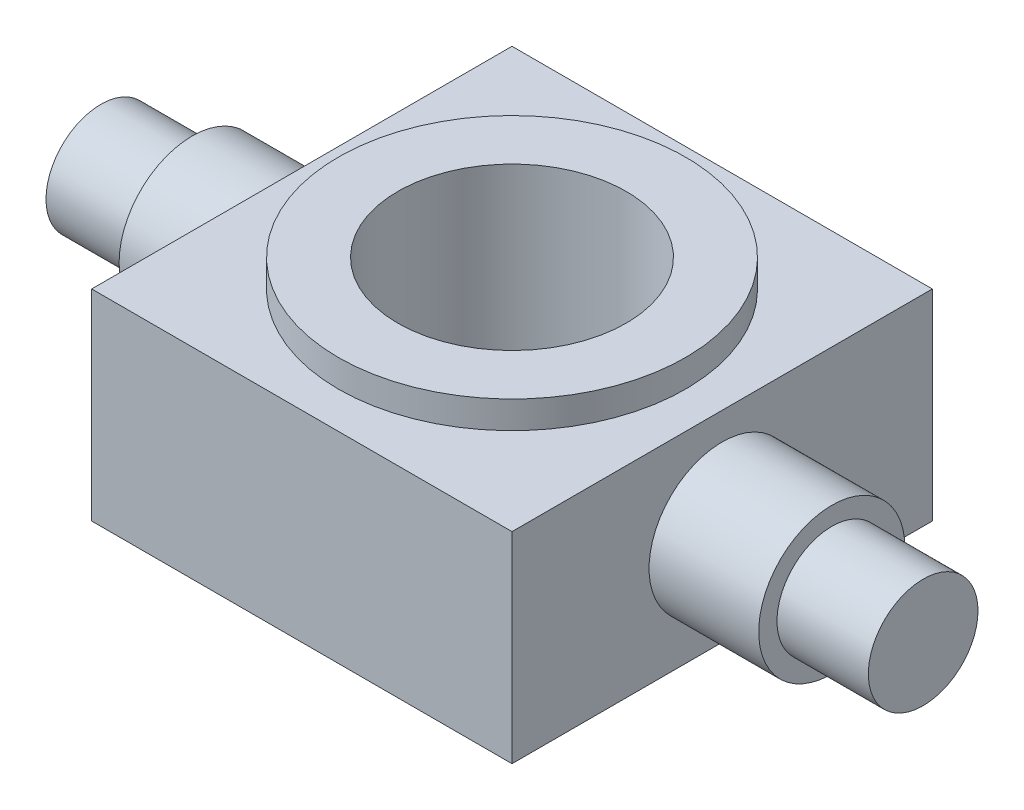
ISO-10303-21;
HEADER;
FILE_DESCRIPTION(('STEP AP214'),'2;1');
FILE_NAME('part.step','',(''),(''),'','','');
FILE_SCHEMA(('AUTOMOTIVE_DESIGN { 1 0 10303 214 1 1 1 1 }'));
ENDSEC;
DATA;
#1=APPLICATION_CONTEXT('core data for automotive mechanical design processes');
#2=APPLICATION_PROTOCOL_DEFINITION('international standard','automotive_design',2000,#1);
#3=PRODUCT_CONTEXT('',#1,'mechanical');
#4=PRODUCT('Part','Part','',(#3));
#5=PRODUCT_RELATED_PRODUCT_CATEGORY('part','',(#4));
#6=PRODUCT_DEFINITION_FORMATION('','',#4);
#7=PRODUCT_DEFINITION_CONTEXT('part definition',#1,'design');
#8=PRODUCT_DEFINITION('design','',#6,#7);
#9=PRODUCT_DEFINITION_SHAPE('','',#8);
#10=(LENGTH_UNIT() NAMED_UNIT(*) SI_UNIT(.MILLI.,.METRE.));
#11=(NAMED_UNIT(*) PLANE_ANGLE_UNIT() SI_UNIT($,.RADIAN.));
#12=(NAMED_UNIT(*) SI_UNIT($,.STERADIAN.) SOLID_ANGLE_UNIT());
#13=UNCERTAINTY_MEASURE_WITH_UNIT(LENGTH_MEASURE(1.E-05),#10,'distance_accuracy_value','');
#14=(GEOMETRIC_REPRESENTATION_CONTEXT(3) GLOBAL_UNCERTAINTY_ASSIGNED_CONTEXT((#13)) GLOBAL_UNIT_ASSIGNED_CONTEXT((#10,
#11,#12)) REPRESENTATION_CONTEXT('',''));
#15=CARTESIAN_POINT('',(0.,0.,0.));
#16=DIRECTION('',(0.,0.,1.));
#17=DIRECTION('',(1.,0.,0.));
#18=AXIS2_PLACEMENT_3D('',#15,#16,#17);
#19=CARTESIAN_POINT('',(0.,22.,0.));
#20=DIRECTION('',(0.,1.,0.));
#21=DIRECTION('',(0.,0.,1.));
#22=AXIS2_PLACEMENT_3D('',#19,#20,#21);
#23=PLANE('',#22);
#24=DIRECTION('',(0.,0.,1.));
#25=VECTOR('',#24,1.);
#26=CARTESIAN_POINT('',(23.,22.,0.));
#27=LINE('',#26,#25);
#28=CARTESIAN_POINT('',(23.,22.,-23.));
#29=VERTEX_POINT('',#28);
#30=CARTESIAN_POINT('',(23.,22.,23.));
#31=VERTEX_POINT('',#30);
#32=EDGE_CURVE('E102',#29,#31,#27,.T.);
#33=ORIENTED_EDGE('',*,*,#32,.F.);
#34=DIRECTION('',(1.,0.,0.));
#35=VECTOR('',#34,1.);
#36=CARTESIAN_POINT('',(0.,22.,-23.));
#37=LINE('',#36,#35);
#38=CARTESIAN_POINT('',(-23.,22.,-23.));
#39=VERTEX_POINT('',#38);
#40=EDGE_CURVE('E93',#39,#29,#37,.T.);
#41=ORIENTED_EDGE('',*,*,#40,.F.);
#42=DIRECTION('',(0.,0.,1.));
#43=VECTOR('',#42,1.);
#44=CARTESIAN_POINT('',(-23.,22.,0.));
#45=LINE('',#44,#43);
#46=CARTESIAN_POINT('',(-23.,22.,23.));
#47=VERTEX_POINT('',#46);
#48=EDGE_CURVE('E98',#39,#47,#45,.T.);
#49=ORIENTED_EDGE('',*,*,#48,.T.);
#50=DIRECTION('',(1.,0.,0.));
#51=VECTOR('',#50,1.);
#52=CARTESIAN_POINT('',(0.,22.,23.));
#53=LINE('',#52,#51);
#54=EDGE_CURVE('E58',#47,#31,#53,.T.);
#55=ORIENTED_EDGE('',*,*,#54,.T.);
#56=EDGE_LOOP('',(#33,#41,#49,#55));
#57=FACE_BOUND('',#56,.T.);
#58=CARTESIAN_POINT('',(0.,22.,0.));
#59=DIRECTION('',(0.,1.,0.));
#60=DIRECTION('',(0.,0.,1.));
#61=AXIS2_PLACEMENT_3D('',#58,#59,#60);
#62=CIRCLE('',#61,19.);
#63=CARTESIAN_POINT('',(0.,22.,19.));
#64=VERTEX_POINT('',#63);
#65=EDGE_CURVE('E112',#64,#64,#62,.F.);
#66=ORIENTED_EDGE('',*,*,#65,.T.);
#67=EDGE_LOOP('',(#66));
#68=FACE_BOUND('',#67,.T.);
#69=ADVANCED_FACE('F41',(#57,#68),#23,.T.);
#70=CARTESIAN_POINT('',(23.,22.,0.));
#71=DIRECTION('',(1.,0.,0.));
#72=DIRECTION('',(0.,0.,-1.));
#73=AXIS2_PLACEMENT_3D('',#70,#71,#72);
#74=PLANE('',#73);
#75=CARTESIAN_POINT('',(23.,11.,0.));
#76=DIRECTION('',(1.,0.,0.));
#77=DIRECTION('',(0.,0.,-1.));
#78=AXIS2_PLACEMENT_3D('',#75,#76,#77);
#79=CIRCLE('',#78,8.);
#80=CARTESIAN_POINT('',(23.,11.,-8.00000000000001));
#81=VERTEX_POINT('',#80);
#82=EDGE_CURVE('E234',#81,#81,#79,.T.);
#83=ORIENTED_EDGE('',*,*,#82,.F.);
#84=EDGE_LOOP('',(#83));
#85=FACE_BOUND('',#84,.T.);
#86=DIRECTION('',(0.,0.,1.));
#87=VECTOR('',#86,1.);
#88=CARTESIAN_POINT('',(23.,0.,0.));
#89=LINE('',#88,#87);
#90=CARTESIAN_POINT('',(23.,0.,-23.));
#91=VERTEX_POINT('',#90);
#92=CARTESIAN_POINT('',(23.,0.,23.));
#93=VERTEX_POINT('',#92);
#94=EDGE_CURVE('E109',#91,#93,#89,.T.);
#95=ORIENTED_EDGE('',*,*,#94,.F.);
#96=DIRECTION('',(0.,-1.,0.));
#97=VECTOR('',#96,1.);
#98=CARTESIAN_POINT('',(23.,22.,-23.));
#99=LINE('',#98,#97);
#100=EDGE_CURVE('E50',#29,#91,#99,.T.);
#101=ORIENTED_EDGE('',*,*,#100,.F.);
#102=ORIENTED_EDGE('',*,*,#32,.T.);
#103=DIRECTION('',(0.,-1.,0.));
#104=VECTOR('',#103,1.);
#105=CARTESIAN_POINT('',(23.,22.,23.));
#106=LINE('',#105,#104);
#107=EDGE_CURVE('E81',#31,#93,#106,.T.);
#108=ORIENTED_EDGE('',*,*,#107,.T.);
#109=EDGE_LOOP('',(#95,#101,#102,#108));
#110=FACE_BOUND('',#109,.T.);
#111=ADVANCED_FACE('F43',(#85,#110),#74,.T.);
#112=CARTESIAN_POINT('',(0.,22.,-23.));
#113=DIRECTION('',(0.,0.,-1.));
#114=DIRECTION('',(-1.,0.,0.));
#115=AXIS2_PLACEMENT_3D('',#112,#113,#114);
#116=PLANE('',#115);
#117=DIRECTION('',(1.,0.,0.));
#118=VECTOR('',#117,1.);
#119=CARTESIAN_POINT('',(0.,0.,-23.));
#120=LINE('',#119,#118);
#121=CARTESIAN_POINT('',(-23.,0.,-23.));
#122=VERTEX_POINT('',#121);
#123=EDGE_CURVE('E95',#122,#91,#120,.T.);
#124=ORIENTED_EDGE('',*,*,#123,.F.);
#125=DIRECTION('',(0.,-1.,0.));
#126=VECTOR('',#125,1.);
#127=CARTESIAN_POINT('',(-23.,22.,-23.));
#128=LINE('',#127,#126);
#129=EDGE_CURVE('E89',#39,#122,#128,.T.);
#130=ORIENTED_EDGE('',*,*,#129,.F.);
#131=ORIENTED_EDGE('',*,*,#40,.T.);
#132=ORIENTED_EDGE('',*,*,#100,.T.);
#133=EDGE_LOOP('',(#124,#130,#131,#132));
#134=FACE_BOUND('',#133,.T.);
#135=ADVANCED_FACE('F91',(#134),#116,.T.);
#136=CARTESIAN_POINT('',(-23.,22.,0.));
#137=DIRECTION('',(1.,0.,0.));
#138=DIRECTION('',(0.,0.,-1.));
#139=AXIS2_PLACEMENT_3D('',#136,#137,#138);
#140=PLANE('',#139);
#141=CARTESIAN_POINT('',(-23.,11.,0.));
#142=DIRECTION('',(1.,0.,0.));
#143=DIRECTION('',(0.,0.,-1.));
#144=AXIS2_PLACEMENT_3D('',#141,#142,#143);
#145=CIRCLE('',#144,8.);
#146=CARTESIAN_POINT('',(-23.,11.,-7.99999999999999));
#147=VERTEX_POINT('',#146);
#148=EDGE_CURVE('E11',#147,#147,#145,.F.);
#149=ORIENTED_EDGE('',*,*,#148,.F.);
#150=EDGE_LOOP('',(#149));
#151=FACE_BOUND('',#150,.T.);
#152=DIRECTION('',(0.,0.,1.));
#153=VECTOR('',#152,1.);
#154=CARTESIAN_POINT('',(-23.,0.,0.));
#155=LINE('',#154,#153);
#156=CARTESIAN_POINT('',(-23.,0.,23.));
#157=VERTEX_POINT('',#156);
#158=EDGE_CURVE('E74',#122,#157,#155,.T.);
#159=ORIENTED_EDGE('',*,*,#158,.T.);
#160=DIRECTION('',(0.,-1.,0.));
#161=VECTOR('',#160,1.);
#162=CARTESIAN_POINT('',(-23.,22.,23.));
#163=LINE('',#162,#161);
#164=EDGE_CURVE('E96',#47,#157,#163,.T.);
#165=ORIENTED_EDGE('',*,*,#164,.F.);
#166=ORIENTED_EDGE('',*,*,#48,.F.);
#167=ORIENTED_EDGE('',*,*,#129,.T.);
#168=EDGE_LOOP('',(#159,#165,#166,#167));
#169=FACE_BOUND('',#168,.T.);
#170=ADVANCED_FACE('F99',(#151,#169),#140,.F.);
#171=CARTESIAN_POINT('',(0.,22.,23.));
#172=DIRECTION('',(0.,0.,-1.));
#173=DIRECTION('',(-1.,0.,0.));
#174=AXIS2_PLACEMENT_3D('',#171,#172,#173);
#175=PLANE('',#174);
#176=DIRECTION('',(1.,0.,0.));
#177=VECTOR('',#176,1.);
#178=CARTESIAN_POINT('',(0.,0.,23.));
#179=LINE('',#178,#177);
#180=EDGE_CURVE('E104',#157,#93,#179,.T.);
#181=ORIENTED_EDGE('',*,*,#180,.T.);
#182=ORIENTED_EDGE('',*,*,#107,.F.);
#183=ORIENTED_EDGE('',*,*,#54,.F.);
#184=ORIENTED_EDGE('',*,*,#164,.T.);
#185=EDGE_LOOP('',(#181,#182,#183,#184));
#186=FACE_BOUND('',#185,.T.);
#187=ADVANCED_FACE('F121',(#186),#175,.F.);
#188=CARTESIAN_POINT('',(0.,22.,0.));
#189=DIRECTION('',(0.,-1.,0.));
#190=DIRECTION('',(0.,0.,-1.));
#191=AXIS2_PLACEMENT_3D('',#188,#189,#190);
#192=CYLINDRICAL_SURFACE('',#191,12.5);
#193=CARTESIAN_POINT('',(0.,25.,0.));
#194=DIRECTION('',(0.,1.,0.));
#195=DIRECTION('',(0.,0.,1.));
#196=AXIS2_PLACEMENT_3D('',#193,#194,#195);
#197=CIRCLE('',#196,12.5);
#198=CARTESIAN_POINT('',(0.,25.,12.5));
#199=VERTEX_POINT('',#198);
#200=EDGE_CURVE('E168',#199,#199,#197,.T.);
#201=ORIENTED_EDGE('',*,*,#200,.T.);
#202=EDGE_LOOP('',(#201));
#203=FACE_BOUND('',#202,.T.);
#204=CARTESIAN_POINT('',(0.,-3.,0.));
#205=DIRECTION('',(0.,1.,0.));
#206=DIRECTION('',(0.,0.,1.));
#207=AXIS2_PLACEMENT_3D('',#204,#205,#206);
#208=CIRCLE('',#207,12.5);
#209=CARTESIAN_POINT('',(0.,-3.,12.5));
#210=VERTEX_POINT('',#209);
#211=EDGE_CURVE('E158',#210,#210,#208,.T.);
#212=ORIENTED_EDGE('',*,*,#211,.F.);
#213=EDGE_LOOP('',(#212));
#214=FACE_BOUND('',#213,.T.);
#215=ADVANCED_FACE('F123',(#203,#214),#192,.F.);
#216=CARTESIAN_POINT('',(0.,0.,0.));
#217=DIRECTION('',(0.,1.,0.));
#218=DIRECTION('',(0.,0.,1.));
#219=AXIS2_PLACEMENT_3D('',#216,#217,#218);
#220=PLANE('',#219);
#221=CARTESIAN_POINT('',(0.,0.,0.));
#222=DIRECTION('',(0.,1.,0.));
#223=DIRECTION('',(0.,0.,1.));
#224=AXIS2_PLACEMENT_3D('',#221,#222,#223);
#225=CIRCLE('',#224,19.);
#226=CARTESIAN_POINT('',(0.,0.,19.));
#227=VERTEX_POINT('',#226);
#228=EDGE_CURVE('E152',#227,#227,#225,.T.);
#229=ORIENTED_EDGE('',*,*,#228,.T.);
#230=EDGE_LOOP('',(#229));
#231=FACE_BOUND('',#230,.T.);
#232=ORIENTED_EDGE('',*,*,#94,.T.);
#233=ORIENTED_EDGE('',*,*,#180,.F.);
#234=ORIENTED_EDGE('',*,*,#158,.F.);
#235=ORIENTED_EDGE('',*,*,#123,.T.);
#236=EDGE_LOOP('',(#232,#233,#234,#235));
#237=FACE_BOUND('',#236,.T.);
#238=ADVANCED_FACE('F119',(#231,#237),#220,.F.);
#239=CARTESIAN_POINT('',(0.,25.,0.));
#240=DIRECTION('',(0.,-1.,0.));
#241=DIRECTION('',(0.,0.,-1.));
#242=AXIS2_PLACEMENT_3D('',#239,#240,#241);
#243=CYLINDRICAL_SURFACE('',#242,19.);
#244=ORIENTED_EDGE('',*,*,#65,.F.);
#245=EDGE_LOOP('',(#244));
#246=FACE_BOUND('',#245,.T.);
#247=CARTESIAN_POINT('',(0.,25.,0.));
#248=DIRECTION('',(0.,1.,0.));
#249=DIRECTION('',(0.,0.,1.));
#250=AXIS2_PLACEMENT_3D('',#247,#248,#249);
#251=CIRCLE('',#250,19.);
#252=CARTESIAN_POINT('',(0.,25.,19.));
#253=VERTEX_POINT('',#252);
#254=EDGE_CURVE('E165',#253,#253,#251,.T.);
#255=ORIENTED_EDGE('',*,*,#254,.F.);
#256=EDGE_LOOP('',(#255));
#257=FACE_BOUND('',#256,.T.);
#258=ADVANCED_FACE('F141',(#246,#257),#243,.T.);
#259=CARTESIAN_POINT('',(0.,25.,0.));
#260=DIRECTION('',(0.,1.,0.));
#261=DIRECTION('',(0.,0.,1.));
#262=AXIS2_PLACEMENT_3D('',#259,#260,#261);
#263=PLANE('',#262);
#264=ORIENTED_EDGE('',*,*,#254,.T.);
#265=EDGE_LOOP('',(#264));
#266=FACE_BOUND('',#265,.T.);
#267=ORIENTED_EDGE('',*,*,#200,.F.);
#268=EDGE_LOOP('',(#267));
#269=FACE_BOUND('',#268,.T.);
#270=ADVANCED_FACE('F148',(#266,#269),#263,.T.);
#271=CARTESIAN_POINT('',(0.,-3.,0.));
#272=DIRECTION('',(0.,1.,0.));
#273=DIRECTION('',(0.,0.,1.));
#274=AXIS2_PLACEMENT_3D('',#271,#272,#273);
#275=CYLINDRICAL_SURFACE('',#274,19.);
#276=CARTESIAN_POINT('',(0.,-3.,0.));
#277=DIRECTION('',(0.,1.,0.));
#278=DIRECTION('',(0.,0.,1.));
#279=AXIS2_PLACEMENT_3D('',#276,#277,#278);
#280=CIRCLE('',#279,19.);
#281=CARTESIAN_POINT('',(0.,-3.,19.));
#282=VERTEX_POINT('',#281);
#283=EDGE_CURVE('E154',#282,#282,#280,.T.);
#284=ORIENTED_EDGE('',*,*,#283,.T.);
#285=EDGE_LOOP('',(#284));
#286=FACE_BOUND('',#285,.T.);
#287=ORIENTED_EDGE('',*,*,#228,.F.);
#288=EDGE_LOOP('',(#287));
#289=FACE_BOUND('',#288,.T.);
#290=ADVANCED_FACE('F177',(#286,#289),#275,.T.);
#291=CARTESIAN_POINT('',(0.,-3.,0.));
#292=DIRECTION('',(0.,1.,0.));
#293=DIRECTION('',(0.,0.,1.));
#294=AXIS2_PLACEMENT_3D('',#291,#292,#293);
#295=PLANE('',#294);
#296=ORIENTED_EDGE('',*,*,#283,.F.);
#297=EDGE_LOOP('',(#296));
#298=FACE_BOUND('',#297,.T.);
#299=ORIENTED_EDGE('',*,*,#211,.T.);
#300=EDGE_LOOP('',(#299));
#301=FACE_BOUND('',#300,.T.);
#302=ADVANCED_FACE('F183',(#298,#301),#295,.F.);
#303=CARTESIAN_POINT('',(-35.,11.,0.));
#304=DIRECTION('',(-1.,0.,0.));
#305=DIRECTION('',(0.,0.,1.));
#306=AXIS2_PLACEMENT_3D('',#303,#304,#305);
#307=PLANE('',#306);
#308=CARTESIAN_POINT('',(-35.,11.,0.));
#309=DIRECTION('',(-1.,0.,0.));
#310=DIRECTION('',(0.,0.,1.));
#311=AXIS2_PLACEMENT_3D('',#308,#309,#310);
#312=CIRCLE('',#311,8.);
#313=CARTESIAN_POINT('',(-35.,11.,8.00000000000001));
#314=VERTEX_POINT('',#313);
#315=EDGE_CURVE('E155',#314,#314,#312,.T.);
#316=ORIENTED_EDGE('',*,*,#315,.T.);
#317=EDGE_LOOP('',(#316));
#318=FACE_BOUND('',#317,.T.);
#319=CARTESIAN_POINT('',(-35.,11.,0.));
#320=DIRECTION('',(-1.,0.,0.));
#321=DIRECTION('',(0.,0.,1.));
#322=AXIS2_PLACEMENT_3D('',#319,#320,#321);
#323=CIRCLE('',#322,6.);
#324=CARTESIAN_POINT('',(-35.,11.,6.00000000000001));
#325=VERTEX_POINT('',#324);
#326=EDGE_CURVE('E161',#325,#325,#323,.T.);
#327=ORIENTED_EDGE('',*,*,#326,.F.);
#328=EDGE_LOOP('',(#327));
#329=FACE_BOUND('',#328,.T.);
#330=ADVANCED_FACE('F185',(#318,#329),#307,.T.);
#331=CARTESIAN_POINT('',(-35.,11.,0.));
#332=DIRECTION('',(1.,0.,0.));
#333=DIRECTION('',(0.,0.,-1.));
#334=AXIS2_PLACEMENT_3D('',#331,#332,#333);
#335=CYLINDRICAL_SURFACE('',#334,8.);
#336=ORIENTED_EDGE('',*,*,#315,.F.);
#337=EDGE_LOOP('',(#336));
#338=FACE_BOUND('',#337,.T.);
#339=ORIENTED_EDGE('',*,*,#148,.T.);
#340=EDGE_LOOP('',(#339));
#341=FACE_BOUND('',#340,.T.);
#342=ADVANCED_FACE('F192',(#338,#341),#335,.T.);
#343=CARTESIAN_POINT('',(-45.,11.,0.));
#344=DIRECTION('',(1.,0.,0.));
#345=DIRECTION('',(0.,0.,-1.));
#346=AXIS2_PLACEMENT_3D('',#343,#344,#345);
#347=CYLINDRICAL_SURFACE('',#346,6.);
#348=ORIENTED_EDGE('',*,*,#326,.T.);
#349=EDGE_LOOP('',(#348));
#350=FACE_BOUND('',#349,.T.);
#351=CARTESIAN_POINT('',(-45.,11.,0.));
#352=DIRECTION('',(-1.,0.,0.));
#353=DIRECTION('',(0.,0.,1.));
#354=AXIS2_PLACEMENT_3D('',#351,#352,#353);
#355=CIRCLE('',#354,6.);
#356=CARTESIAN_POINT('',(-45.,11.,6.00000000000001));
#357=VERTEX_POINT('',#356);
#358=EDGE_CURVE('E240',#357,#357,#355,.T.);
#359=ORIENTED_EDGE('',*,*,#358,.F.);
#360=EDGE_LOOP('',(#359));
#361=FACE_BOUND('',#360,.T.);
#362=ADVANCED_FACE('F200',(#350,#361),#347,.T.);
#363=CARTESIAN_POINT('',(-45.,0.,0.));
#364=DIRECTION('',(-1.,0.,0.));
#365=DIRECTION('',(0.,0.,1.));
#366=AXIS2_PLACEMENT_3D('',#363,#364,#365);
#367=PLANE('',#366);
#368=ORIENTED_EDGE('',*,*,#358,.T.);
#369=EDGE_LOOP('',(#368));
#370=FACE_BOUND('',#369,.T.);
#371=ADVANCED_FACE('F205',(#370),#367,.T.);
#372=CARTESIAN_POINT('',(35.,11.,0.));
#373=DIRECTION('',(1.,0.,0.));
#374=DIRECTION('',(0.,0.,-1.));
#375=AXIS2_PLACEMENT_3D('',#372,#373,#374);
#376=PLANE('',#375);
#377=CARTESIAN_POINT('',(35.,11.,0.));
#378=DIRECTION('',(1.,0.,0.));
#379=DIRECTION('',(0.,0.,-1.));
#380=AXIS2_PLACEMENT_3D('',#377,#378,#379);
#381=CIRCLE('',#380,8.);
#382=CARTESIAN_POINT('',(35.,11.,-8.00000000000001));
#383=VERTEX_POINT('',#382);
#384=EDGE_CURVE('E237',#383,#383,#381,.T.);
#385=ORIENTED_EDGE('',*,*,#384,.T.);
#386=EDGE_LOOP('',(#385));
#387=FACE_BOUND('',#386,.T.);
#388=CARTESIAN_POINT('',(35.,11.,0.));
#389=DIRECTION('',(1.,0.,0.));
#390=DIRECTION('',(0.,0.,-1.));
#391=AXIS2_PLACEMENT_3D('',#388,#389,#390);
#392=CIRCLE('',#391,6.);
#393=CARTESIAN_POINT('',(35.,11.,-6.00000000000001));
#394=VERTEX_POINT('',#393);
#395=EDGE_CURVE('E231',#394,#394,#392,.T.);
#396=ORIENTED_EDGE('',*,*,#395,.F.);
#397=EDGE_LOOP('',(#396));
#398=FACE_BOUND('',#397,.T.);
#399=ADVANCED_FACE('F209',(#387,#398),#376,.T.);
#400=CARTESIAN_POINT('',(35.,11.,0.));
#401=DIRECTION('',(-1.,0.,0.));
#402=DIRECTION('',(0.,0.,1.));
#403=AXIS2_PLACEMENT_3D('',#400,#401,#402);
#404=CYLINDRICAL_SURFACE('',#403,8.);
#405=ORIENTED_EDGE('',*,*,#384,.F.);
#406=EDGE_LOOP('',(#405));
#407=FACE_BOUND('',#406,.T.);
#408=ORIENTED_EDGE('',*,*,#82,.T.);
#409=EDGE_LOOP('',(#408));
#410=FACE_BOUND('',#409,.T.);
#411=ADVANCED_FACE('F211',(#407,#410),#404,.T.);
#412=CARTESIAN_POINT('',(45.,11.,0.));
#413=DIRECTION('',(-1.,0.,0.));
#414=DIRECTION('',(0.,0.,1.));
#415=AXIS2_PLACEMENT_3D('',#412,#413,#414);
#416=CYLINDRICAL_SURFACE('',#415,6.);
#417=ORIENTED_EDGE('',*,*,#395,.T.);
#418=EDGE_LOOP('',(#417));
#419=FACE_BOUND('',#418,.T.);
#420=CARTESIAN_POINT('',(45.,11.,0.));
#421=DIRECTION('',(1.,0.,0.));
#422=DIRECTION('',(0.,0.,-1.));
#423=AXIS2_PLACEMENT_3D('',#420,#421,#422);
#424=CIRCLE('',#423,6.);
#425=CARTESIAN_POINT('',(45.,11.,-6.00000000000001));
#426=VERTEX_POINT('',#425);
#427=EDGE_CURVE('E229',#426,#426,#424,.T.);
#428=ORIENTED_EDGE('',*,*,#427,.F.);
#429=EDGE_LOOP('',(#428));
#430=FACE_BOUND('',#429,.T.);
#431=ADVANCED_FACE('F214',(#419,#430),#416,.T.);
#432=CARTESIAN_POINT('',(45.,0.,0.));
#433=DIRECTION('',(1.,0.,0.));
#434=DIRECTION('',(0.,0.,-1.));
#435=AXIS2_PLACEMENT_3D('',#432,#433,#434);
#436=PLANE('',#435);
#437=ORIENTED_EDGE('',*,*,#427,.T.);
#438=EDGE_LOOP('',(#437));
#439=FACE_BOUND('',#438,.T.);
#440=ADVANCED_FACE('F221',(#439),#436,.T.);
#441=CLOSED_SHELL('',(#69,#111,#135,#170,#187,#215,#238,#258,#270,#290,#302,#330,#342,#362,#371,
#399,#411,#431,#440));
#442=MANIFOLD_SOLID_BREP('B2',#441);
#443=ADVANCED_BREP_SHAPE_REPRESENTATION('',(#18,#442),#14);
#444=SHAPE_DEFINITION_REPRESENTATION(#9,#443);
ENDSEC;
END-ISO-10303-21;
